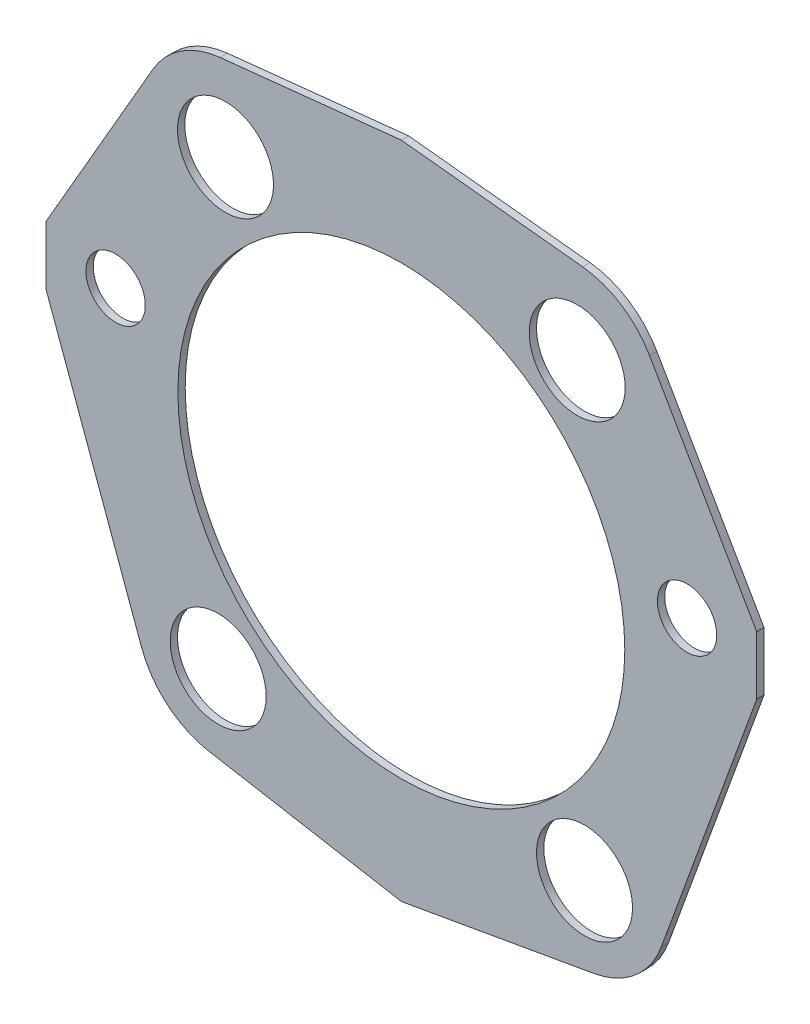
ISO-10303-21;
HEADER;
FILE_DESCRIPTION(('STEP AP214'),'2;1');
FILE_NAME('part.step','',(''),(''),'','','');
FILE_SCHEMA(('AUTOMOTIVE_DESIGN { 1 0 10303 214 1 1 1 1 }'));
ENDSEC;
DATA;
#1=APPLICATION_CONTEXT('core data for automotive mechanical design processes');
#2=APPLICATION_PROTOCOL_DEFINITION('international standard','automotive_design',2000,#1);
#3=PRODUCT_CONTEXT('',#1,'mechanical');
#4=PRODUCT('Part','Part','',(#3));
#5=PRODUCT_RELATED_PRODUCT_CATEGORY('part','',(#4));
#6=PRODUCT_DEFINITION_FORMATION('','',#4);
#7=PRODUCT_DEFINITION_CONTEXT('part definition',#1,'design');
#8=PRODUCT_DEFINITION('design','',#6,#7);
#9=PRODUCT_DEFINITION_SHAPE('','',#8);
#10=(LENGTH_UNIT() NAMED_UNIT(*) SI_UNIT(.MILLI.,.METRE.));
#11=(NAMED_UNIT(*) PLANE_ANGLE_UNIT() SI_UNIT($,.RADIAN.));
#12=(NAMED_UNIT(*) SI_UNIT($,.STERADIAN.) SOLID_ANGLE_UNIT());
#13=UNCERTAINTY_MEASURE_WITH_UNIT(LENGTH_MEASURE(1.E-05),#10,'distance_accuracy_value','');
#14=(GEOMETRIC_REPRESENTATION_CONTEXT(3) GLOBAL_UNCERTAINTY_ASSIGNED_CONTEXT((#13)) GLOBAL_UNIT_ASSIGNED_CONTEXT((#10,
#11,#12)) REPRESENTATION_CONTEXT('',''));
#15=CARTESIAN_POINT('',(0.,0.,0.));
#16=DIRECTION('',(0.,0.,1.));
#17=DIRECTION('',(1.,0.,0.));
#18=AXIS2_PLACEMENT_3D('',#15,#16,#17);
#19=CARTESIAN_POINT('',(0.,45.,-1.));
#20=DIRECTION('',(-0.104528463267654,0.994521895368273,0.));
#21=DIRECTION('',(-0.994521895368273,-0.104528463267654,0.));
#22=AXIS2_PLACEMENT_3D('',#19,#20,#21);
#23=PLANE('',#22);
#24=DIRECTION('',(-0.994521895368273,-0.104528463267654,0.));
#25=VECTOR('',#24,1.);
#26=CARTESIAN_POINT('',(0.,45.,0.));
#27=LINE('',#26,#25);
#28=CARTESIAN_POINT('',(0.,45.,0.));
#29=VERTEX_POINT('',#28);
#30=CARTESIAN_POINT('',(-24.7424653911129,42.3994620964796,0.));
#31=VERTEX_POINT('',#30);
#32=EDGE_CURVE('E174',#29,#31,#27,.T.);
#33=ORIENTED_EDGE('',*,*,#32,.F.);
#34=DIRECTION('',(0.,0.,1.));
#35=VECTOR('',#34,1.);
#36=CARTESIAN_POINT('',(0.,45.,-1.));
#37=LINE('',#36,#35);
#38=CARTESIAN_POINT('',(0.,45.,-1.));
#39=VERTEX_POINT('',#38);
#40=EDGE_CURVE('E11',#39,#29,#37,.T.);
#41=ORIENTED_EDGE('',*,*,#40,.F.);
#42=DIRECTION('',(-0.994521895368273,-0.104528463267654,0.));
#43=VECTOR('',#42,1.);
#44=CARTESIAN_POINT('',(0.,45.,-1.));
#45=LINE('',#44,#43);
#46=CARTESIAN_POINT('',(-24.7424653911129,42.3994620964796,-1.));
#47=VERTEX_POINT('',#46);
#48=EDGE_CURVE('E213',#39,#47,#45,.T.);
#49=ORIENTED_EDGE('',*,*,#48,.T.);
#50=DIRECTION('',(0.,0.,1.));
#51=VECTOR('',#50,1.);
#52=CARTESIAN_POINT('',(-24.7424653911129,42.3994620964796,-1.));
#53=LINE('',#52,#51);
#54=EDGE_CURVE('E44',#47,#31,#53,.T.);
#55=ORIENTED_EDGE('',*,*,#54,.T.);
#56=EDGE_LOOP('',(#33,#41,#49,#55));
#57=FACE_BOUND('',#56,.T.);
#58=ADVANCED_FACE('F41',(#57),#23,.T.);
#59=CARTESIAN_POINT('',(0.,45.,-1.));
#60=DIRECTION('',(0.104528463267654,0.994521895368273,0.));
#61=DIRECTION('',(-0.994521895368273,0.104528463267654,0.));
#62=AXIS2_PLACEMENT_3D('',#59,#60,#61);
#63=PLANE('',#62);
#64=DIRECTION('',(-0.994521895368273,0.104528463267654,0.));
#65=VECTOR('',#64,1.);
#66=CARTESIAN_POINT('',(0.,45.,0.));
#67=LINE('',#66,#65);
#68=CARTESIAN_POINT('',(24.7424653911129,42.3994620964796,0.));
#69=VERTEX_POINT('',#68);
#70=EDGE_CURVE('E211',#69,#29,#67,.T.);
#71=ORIENTED_EDGE('',*,*,#70,.F.);
#72=DIRECTION('',(0.,0.,1.));
#73=VECTOR('',#72,1.);
#74=CARTESIAN_POINT('',(24.7424653911129,42.3994620964796,-1.));
#75=LINE('',#74,#73);
#76=CARTESIAN_POINT('',(24.7424653911129,42.3994620964796,-1.));
#77=VERTEX_POINT('',#76);
#78=EDGE_CURVE('E50',#77,#69,#75,.T.);
#79=ORIENTED_EDGE('',*,*,#78,.F.);
#80=DIRECTION('',(-0.994521895368273,0.104528463267654,0.));
#81=VECTOR('',#80,1.);
#82=CARTESIAN_POINT('',(0.,45.,-1.));
#83=LINE('',#82,#81);
#84=EDGE_CURVE('E164',#77,#39,#83,.T.);
#85=ORIENTED_EDGE('',*,*,#84,.T.);
#86=ORIENTED_EDGE('',*,*,#40,.T.);
#87=EDGE_LOOP('',(#71,#79,#85,#86));
#88=FACE_BOUND('',#87,.T.);
#89=ADVANCED_FACE('F237',(#88),#63,.T.);
#90=CARTESIAN_POINT('',(23.488123831901,30.4651993520603,-1.));
#91=DIRECTION('',(0.,0.,1.));
#92=DIRECTION('',(1.,0.,0.));
#93=AXIS2_PLACEMENT_3D('',#90,#91,#92);
#94=CYLINDRICAL_SURFACE('',#93,12.);
#95=CARTESIAN_POINT('',(23.488123831901,30.4651993520603,0.));
#96=DIRECTION('',(0.,0.,1.));
#97=DIRECTION('',(-1.,0.,0.));
#98=AXIS2_PLACEMENT_3D('',#95,#96,#97);
#99=CIRCLE('',#98,12.);
#100=CARTESIAN_POINT('',(33.8804286773143,36.4651993520603,0.));
#101=VERTEX_POINT('',#100);
#102=EDGE_CURVE('E151',#101,#69,#99,.T.);
#103=ORIENTED_EDGE('',*,*,#102,.F.);
#104=DIRECTION('',(0.,0.,1.));
#105=VECTOR('',#104,1.);
#106=CARTESIAN_POINT('',(33.8804286773143,36.4651993520603,-1.));
#107=LINE('',#106,#105);
#108=CARTESIAN_POINT('',(33.8804286773143,36.4651993520603,-1.));
#109=VERTEX_POINT('',#108);
#110=EDGE_CURVE('E146',#109,#101,#107,.T.);
#111=ORIENTED_EDGE('',*,*,#110,.F.);
#112=CARTESIAN_POINT('',(23.488123831901,30.4651993520603,-1.));
#113=DIRECTION('',(0.,0.,1.));
#114=DIRECTION('',(-1.,0.,0.));
#115=AXIS2_PLACEMENT_3D('',#112,#113,#114);
#116=CIRCLE('',#115,12.);
#117=EDGE_CURVE('E149',#109,#77,#116,.T.);
#118=ORIENTED_EDGE('',*,*,#117,.T.);
#119=ORIENTED_EDGE('',*,*,#78,.T.);
#120=EDGE_LOOP('',(#103,#111,#118,#119));
#121=FACE_BOUND('',#120,.T.);
#122=ADVANCED_FACE('F148',(#121),#94,.T.);
#123=CARTESIAN_POINT('',(33.8804286773143,36.4651993520603,-1.));
#124=DIRECTION('',(0.86602540378444,0.499999999999998,0.));
#125=DIRECTION('',(-0.499999999999998,0.86602540378444,0.));
#126=AXIS2_PLACEMENT_3D('',#123,#124,#125);
#127=PLANE('',#126);
#128=DIRECTION('',(-0.499999999999998,0.86602540378444,0.));
#129=VECTOR('',#128,1.);
#130=CARTESIAN_POINT('',(33.8804286773143,36.4651993520603,0.));
#131=LINE('',#130,#129);
#132=CARTESIAN_POINT('',(48.5,11.1433590362916,0.));
#133=VERTEX_POINT('',#132);
#134=EDGE_CURVE('E208',#133,#101,#131,.T.);
#135=ORIENTED_EDGE('',*,*,#134,.F.);
#136=DIRECTION('',(0.,0.,1.));
#137=VECTOR('',#136,1.);
#138=CARTESIAN_POINT('',(48.5,11.1433590362916,-1.));
#139=LINE('',#138,#137);
#140=CARTESIAN_POINT('',(48.5,11.1433590362916,-1.));
#141=VERTEX_POINT('',#140);
#142=EDGE_CURVE('E156',#141,#133,#139,.T.);
#143=ORIENTED_EDGE('',*,*,#142,.F.);
#144=DIRECTION('',(-0.499999999999998,0.86602540378444,0.));
#145=VECTOR('',#144,1.);
#146=CARTESIAN_POINT('',(33.8804286773143,36.4651993520603,-1.));
#147=LINE('',#146,#145);
#148=EDGE_CURVE('E162',#141,#109,#147,.T.);
#149=ORIENTED_EDGE('',*,*,#148,.T.);
#150=ORIENTED_EDGE('',*,*,#110,.T.);
#151=EDGE_LOOP('',(#135,#143,#149,#150));
#152=FACE_BOUND('',#151,.T.);
#153=ADVANCED_FACE('F166',(#152),#127,.T.);
#154=CARTESIAN_POINT('',(48.5,11.1433590362916,-1.));
#155=DIRECTION('',(1.,0.,0.));
#156=DIRECTION('',(0.,0.,-1.));
#157=AXIS2_PLACEMENT_3D('',#154,#155,#156);
#158=PLANE('',#157);
#159=DIRECTION('',(0.,1.,0.));
#160=VECTOR('',#159,1.);
#161=CARTESIAN_POINT('',(48.5,11.1433590362916,0.));
#162=LINE('',#161,#160);
#163=CARTESIAN_POINT('',(48.5,3.14335903629156,0.));
#164=VERTEX_POINT('',#163);
#165=EDGE_CURVE('E205',#164,#133,#162,.T.);
#166=ORIENTED_EDGE('',*,*,#165,.F.);
#167=DIRECTION('',(0.,0.,1.));
#168=VECTOR('',#167,1.);
#169=CARTESIAN_POINT('',(48.5,3.14335903629156,-1.));
#170=LINE('',#169,#168);
#171=CARTESIAN_POINT('',(48.5,3.14335903629156,-1.));
#172=VERTEX_POINT('',#171);
#173=EDGE_CURVE('E217',#172,#164,#170,.T.);
#174=ORIENTED_EDGE('',*,*,#173,.F.);
#175=DIRECTION('',(0.,1.,0.));
#176=VECTOR('',#175,1.);
#177=CARTESIAN_POINT('',(48.5,11.1433590362916,-1.));
#178=LINE('',#177,#176);
#179=EDGE_CURVE('E167',#172,#141,#178,.T.);
#180=ORIENTED_EDGE('',*,*,#179,.T.);
#181=ORIENTED_EDGE('',*,*,#142,.T.);
#182=EDGE_LOOP('',(#166,#174,#180,#181));
#183=FACE_BOUND('',#182,.T.);
#184=ADVANCED_FACE('F250',(#183),#158,.T.);
#185=CARTESIAN_POINT('',(48.5,3.14335903629156,-1.));
#186=DIRECTION('',(0.939692620785907,-0.342020143325672,0.));
#187=DIRECTION('',(0.342020143325672,0.939692620785907,0.));
#188=AXIS2_PLACEMENT_3D('',#185,#186,#187);
#189=PLANE('',#188);
#190=DIRECTION('',(0.342020143325672,0.939692620785907,0.));
#191=VECTOR('',#190,1.);
#192=CARTESIAN_POINT('',(48.5,3.14335903629156,0.));
#193=LINE('',#192,#191);
#194=CARTESIAN_POINT('',(35.4712249054733,-32.6529063390727,0.));
#195=VERTEX_POINT('',#194);
#196=EDGE_CURVE('E202',#195,#164,#193,.T.);
#197=ORIENTED_EDGE('',*,*,#196,.F.);
#198=DIRECTION('',(0.,0.,1.));
#199=VECTOR('',#198,1.);
#200=CARTESIAN_POINT('',(35.4712249054733,-32.6529063390727,-1.));
#201=LINE('',#200,#199);
#202=CARTESIAN_POINT('',(35.4712249054733,-32.6529063390727,-1.));
#203=VERTEX_POINT('',#202);
#204=EDGE_CURVE('E219',#203,#195,#201,.T.);
#205=ORIENTED_EDGE('',*,*,#204,.F.);
#206=DIRECTION('',(0.342020143325672,0.939692620785907,0.));
#207=VECTOR('',#206,1.);
#208=CARTESIAN_POINT('',(48.5,3.14335903629156,-1.));
#209=LINE('',#208,#207);
#210=EDGE_CURVE('E169',#203,#172,#209,.T.);
#211=ORIENTED_EDGE('',*,*,#210,.T.);
#212=ORIENTED_EDGE('',*,*,#173,.T.);
#213=EDGE_LOOP('',(#197,#205,#211,#212));
#214=FACE_BOUND('',#213,.T.);
#215=ADVANCED_FACE('F253',(#214),#189,.T.);
#216=CARTESIAN_POINT('',(24.1949134560425,-28.5486646191647,-1.));
#217=DIRECTION('',(0.,0.,1.));
#218=DIRECTION('',(1.,0.,0.));
#219=AXIS2_PLACEMENT_3D('',#216,#217,#218);
#220=CYLINDRICAL_SURFACE('',#219,12.);
#221=CARTESIAN_POINT('',(24.1949134560425,-28.5486646191647,0.));
#222=DIRECTION('',(0.,0.,1.));
#223=DIRECTION('',(-1.,0.,0.));
#224=AXIS2_PLACEMENT_3D('',#221,#222,#223);
#225=CIRCLE('',#224,12.);
#226=CARTESIAN_POINT('',(26.2786915880455,-40.3663576553112,0.));
#227=VERTEX_POINT('',#226);
#228=EDGE_CURVE('E199',#227,#195,#225,.T.);
#229=ORIENTED_EDGE('',*,*,#228,.F.);
#230=DIRECTION('',(0.,0.,1.));
#231=VECTOR('',#230,1.);
#232=CARTESIAN_POINT('',(26.2786915880455,-40.3663576553112,-1.));
#233=LINE('',#232,#231);
#234=CARTESIAN_POINT('',(26.2786915880455,-40.3663576553112,-1.));
#235=VERTEX_POINT('',#234);
#236=EDGE_CURVE('E221',#235,#227,#233,.T.);
#237=ORIENTED_EDGE('',*,*,#236,.F.);
#238=CARTESIAN_POINT('',(24.1949134560425,-28.5486646191647,-1.));
#239=DIRECTION('',(0.,0.,1.));
#240=DIRECTION('',(-1.,0.,0.));
#241=AXIS2_PLACEMENT_3D('',#238,#239,#240);
#242=CIRCLE('',#241,12.);
#243=EDGE_CURVE('E391',#235,#203,#242,.T.);
#244=ORIENTED_EDGE('',*,*,#243,.T.);
#245=ORIENTED_EDGE('',*,*,#204,.T.);
#246=EDGE_LOOP('',(#229,#237,#244,#245));
#247=FACE_BOUND('',#246,.T.);
#248=ADVANCED_FACE('F257',(#247),#220,.T.);
#249=CARTESIAN_POINT('',(26.2786915880455,-40.3663576553112,-1.));
#250=DIRECTION('',(0.173648177666923,-0.984807753012209,0.));
#251=DIRECTION('',(0.984807753012209,0.173648177666923,0.));
#252=AXIS2_PLACEMENT_3D('',#249,#250,#251);
#253=PLANE('',#252);
#254=DIRECTION('',(0.984807753012209,0.173648177666923,0.));
#255=VECTOR('',#254,1.);
#256=CARTESIAN_POINT('',(26.2786915880455,-40.3663576553112,0.));
#257=LINE('',#256,#255);
#258=CARTESIAN_POINT('',(0.,-45.,0.));
#259=VERTEX_POINT('',#258);
#260=EDGE_CURVE('E196',#259,#227,#257,.T.);
#261=ORIENTED_EDGE('',*,*,#260,.F.);
#262=DIRECTION('',(0.,0.,1.));
#263=VECTOR('',#262,1.);
#264=CARTESIAN_POINT('',(0.,-45.,-1.));
#265=LINE('',#264,#263);
#266=CARTESIAN_POINT('',(0.,-45.,-1.));
#267=VERTEX_POINT('',#266);
#268=EDGE_CURVE('E223',#267,#259,#265,.T.);
#269=ORIENTED_EDGE('',*,*,#268,.F.);
#270=DIRECTION('',(0.984807753012209,0.173648177666923,0.));
#271=VECTOR('',#270,1.);
#272=CARTESIAN_POINT('',(26.2786915880455,-40.3663576553112,-1.));
#273=LINE('',#272,#271);
#274=EDGE_CURVE('E388',#267,#235,#273,.T.);
#275=ORIENTED_EDGE('',*,*,#274,.T.);
#276=ORIENTED_EDGE('',*,*,#236,.T.);
#277=EDGE_LOOP('',(#261,#269,#275,#276));
#278=FACE_BOUND('',#277,.T.);
#279=ADVANCED_FACE('F261',(#278),#253,.T.);
#280=CARTESIAN_POINT('',(-26.2786915880455,-40.3663576553112,-1.));
#281=DIRECTION('',(-0.173648177666923,-0.984807753012209,0.));
#282=DIRECTION('',(0.984807753012209,-0.173648177666923,0.));
#283=AXIS2_PLACEMENT_3D('',#280,#281,#282);
#284=PLANE('',#283);
#285=DIRECTION('',(0.984807753012209,-0.173648177666923,0.));
#286=VECTOR('',#285,1.);
#287=CARTESIAN_POINT('',(-26.2786915880455,-40.3663576553112,0.));
#288=LINE('',#287,#286);
#289=CARTESIAN_POINT('',(-26.2786915880455,-40.3663576553112,0.));
#290=VERTEX_POINT('',#289);
#291=EDGE_CURVE('E193',#290,#259,#288,.T.);
#292=ORIENTED_EDGE('',*,*,#291,.F.);
#293=DIRECTION('',(0.,0.,1.));
#294=VECTOR('',#293,1.);
#295=CARTESIAN_POINT('',(-26.2786915880455,-40.3663576553112,-1.));
#296=LINE('',#295,#294);
#297=CARTESIAN_POINT('',(-26.2786915880455,-40.3663576553112,-1.));
#298=VERTEX_POINT('',#297);
#299=EDGE_CURVE('E225',#298,#290,#296,.T.);
#300=ORIENTED_EDGE('',*,*,#299,.F.);
#301=DIRECTION('',(0.984807753012209,-0.173648177666923,0.));
#302=VECTOR('',#301,1.);
#303=CARTESIAN_POINT('',(-26.2786915880455,-40.3663576553112,-1.));
#304=LINE('',#303,#302);
#305=EDGE_CURVE('E385',#298,#267,#304,.T.);
#306=ORIENTED_EDGE('',*,*,#305,.T.);
#307=ORIENTED_EDGE('',*,*,#268,.T.);
#308=EDGE_LOOP('',(#292,#300,#306,#307));
#309=FACE_BOUND('',#308,.T.);
#310=ADVANCED_FACE('F265',(#309),#284,.T.);
#311=CARTESIAN_POINT('',(-24.1949134560425,-28.5486646191647,-1.));
#312=DIRECTION('',(0.,0.,1.));
#313=DIRECTION('',(1.,0.,0.));
#314=AXIS2_PLACEMENT_3D('',#311,#312,#313);
#315=CYLINDRICAL_SURFACE('',#314,12.);
#316=CARTESIAN_POINT('',(-24.1949134560425,-28.5486646191647,0.));
#317=DIRECTION('',(0.,0.,1.));
#318=DIRECTION('',(1.,0.,0.));
#319=AXIS2_PLACEMENT_3D('',#316,#317,#318);
#320=CIRCLE('',#319,12.);
#321=CARTESIAN_POINT('',(-35.4712249054733,-32.6529063390727,0.));
#322=VERTEX_POINT('',#321);
#323=EDGE_CURVE('E190',#322,#290,#320,.T.);
#324=ORIENTED_EDGE('',*,*,#323,.F.);
#325=DIRECTION('',(0.,0.,1.));
#326=VECTOR('',#325,1.);
#327=CARTESIAN_POINT('',(-35.4712249054733,-32.6529063390727,-1.));
#328=LINE('',#327,#326);
#329=CARTESIAN_POINT('',(-35.4712249054733,-32.6529063390727,-1.));
#330=VERTEX_POINT('',#329);
#331=EDGE_CURVE('E227',#330,#322,#328,.T.);
#332=ORIENTED_EDGE('',*,*,#331,.F.);
#333=CARTESIAN_POINT('',(-24.1949134560425,-28.5486646191647,-1.));
#334=DIRECTION('',(0.,0.,1.));
#335=DIRECTION('',(1.,0.,0.));
#336=AXIS2_PLACEMENT_3D('',#333,#334,#335);
#337=CIRCLE('',#336,12.);
#338=EDGE_CURVE('E382',#330,#298,#337,.T.);
#339=ORIENTED_EDGE('',*,*,#338,.T.);
#340=ORIENTED_EDGE('',*,*,#299,.T.);
#341=EDGE_LOOP('',(#324,#332,#339,#340));
#342=FACE_BOUND('',#341,.T.);
#343=ADVANCED_FACE('F269',(#342),#315,.T.);
#344=CARTESIAN_POINT('',(-48.5,3.14335903629156,-1.));
#345=DIRECTION('',(-0.939692620785907,-0.342020143325672,0.));
#346=DIRECTION('',(0.342020143325672,-0.939692620785907,0.));
#347=AXIS2_PLACEMENT_3D('',#344,#345,#346);
#348=PLANE('',#347);
#349=DIRECTION('',(0.342020143325672,-0.939692620785907,0.));
#350=VECTOR('',#349,1.);
#351=CARTESIAN_POINT('',(-48.5,3.14335903629156,0.));
#352=LINE('',#351,#350);
#353=CARTESIAN_POINT('',(-48.5,3.14335903629156,0.));
#354=VERTEX_POINT('',#353);
#355=EDGE_CURVE('E187',#354,#322,#352,.T.);
#356=ORIENTED_EDGE('',*,*,#355,.F.);
#357=DIRECTION('',(0.,0.,1.));
#358=VECTOR('',#357,1.);
#359=CARTESIAN_POINT('',(-48.5,3.14335903629156,-1.));
#360=LINE('',#359,#358);
#361=CARTESIAN_POINT('',(-48.5,3.14335903629156,-1.));
#362=VERTEX_POINT('',#361);
#363=EDGE_CURVE('E229',#362,#354,#360,.T.);
#364=ORIENTED_EDGE('',*,*,#363,.F.);
#365=DIRECTION('',(0.342020143325672,-0.939692620785907,0.));
#366=VECTOR('',#365,1.);
#367=CARTESIAN_POINT('',(-48.5,3.14335903629156,-1.));
#368=LINE('',#367,#366);
#369=EDGE_CURVE('E379',#362,#330,#368,.T.);
#370=ORIENTED_EDGE('',*,*,#369,.T.);
#371=ORIENTED_EDGE('',*,*,#331,.T.);
#372=EDGE_LOOP('',(#356,#364,#370,#371));
#373=FACE_BOUND('',#372,.T.);
#374=ADVANCED_FACE('F273',(#373),#348,.T.);
#375=CARTESIAN_POINT('',(-48.5,11.1433590362916,-1.));
#376=DIRECTION('',(-1.,0.,0.));
#377=DIRECTION('',(0.,0.,1.));
#378=AXIS2_PLACEMENT_3D('',#375,#376,#377);
#379=PLANE('',#378);
#380=DIRECTION('',(0.,-1.,0.));
#381=VECTOR('',#380,1.);
#382=CARTESIAN_POINT('',(-48.5,11.1433590362916,0.));
#383=LINE('',#382,#381);
#384=CARTESIAN_POINT('',(-48.5,11.1433590362916,0.));
#385=VERTEX_POINT('',#384);
#386=EDGE_CURVE('E184',#385,#354,#383,.T.);
#387=ORIENTED_EDGE('',*,*,#386,.F.);
#388=DIRECTION('',(0.,0.,1.));
#389=VECTOR('',#388,1.);
#390=CARTESIAN_POINT('',(-48.5,11.1433590362916,-1.));
#391=LINE('',#390,#389);
#392=CARTESIAN_POINT('',(-48.5,11.1433590362916,-1.));
#393=VERTEX_POINT('',#392);
#394=EDGE_CURVE('E231',#393,#385,#391,.T.);
#395=ORIENTED_EDGE('',*,*,#394,.F.);
#396=DIRECTION('',(0.,-1.,0.));
#397=VECTOR('',#396,1.);
#398=CARTESIAN_POINT('',(-48.5,11.1433590362916,-1.));
#399=LINE('',#398,#397);
#400=EDGE_CURVE('E376',#393,#362,#399,.T.);
#401=ORIENTED_EDGE('',*,*,#400,.T.);
#402=ORIENTED_EDGE('',*,*,#363,.T.);
#403=EDGE_LOOP('',(#387,#395,#401,#402));
#404=FACE_BOUND('',#403,.T.);
#405=ADVANCED_FACE('F277',(#404),#379,.T.);
#406=CARTESIAN_POINT('',(-33.8804286773143,36.4651993520603,-1.));
#407=DIRECTION('',(-0.86602540378444,0.499999999999997,0.));
#408=DIRECTION('',(-0.499999999999997,-0.86602540378444,0.));
#409=AXIS2_PLACEMENT_3D('',#406,#407,#408);
#410=PLANE('',#409);
#411=DIRECTION('',(-0.499999999999997,-0.86602540378444,0.));
#412=VECTOR('',#411,1.);
#413=CARTESIAN_POINT('',(-33.8804286773143,36.4651993520603,0.));
#414=LINE('',#413,#412);
#415=CARTESIAN_POINT('',(-33.8804286773143,36.4651993520603,0.));
#416=VERTEX_POINT('',#415);
#417=EDGE_CURVE('E181',#416,#385,#414,.T.);
#418=ORIENTED_EDGE('',*,*,#417,.F.);
#419=DIRECTION('',(0.,0.,1.));
#420=VECTOR('',#419,1.);
#421=CARTESIAN_POINT('',(-33.8804286773143,36.4651993520603,-1.));
#422=LINE('',#421,#420);
#423=CARTESIAN_POINT('',(-33.8804286773143,36.4651993520603,-1.));
#424=VERTEX_POINT('',#423);
#425=EDGE_CURVE('E232',#424,#416,#422,.T.);
#426=ORIENTED_EDGE('',*,*,#425,.F.);
#427=DIRECTION('',(-0.499999999999997,-0.86602540378444,0.));
#428=VECTOR('',#427,1.);
#429=CARTESIAN_POINT('',(-33.8804286773143,36.4651993520603,-1.));
#430=LINE('',#429,#428);
#431=EDGE_CURVE('E373',#424,#393,#430,.T.);
#432=ORIENTED_EDGE('',*,*,#431,.T.);
#433=ORIENTED_EDGE('',*,*,#394,.T.);
#434=EDGE_LOOP('',(#418,#426,#432,#433));
#435=FACE_BOUND('',#434,.T.);
#436=ADVANCED_FACE('F281',(#435),#410,.T.);
#437=CARTESIAN_POINT('',(-23.488123831901,30.4651993520603,-1.));
#438=DIRECTION('',(0.,0.,1.));
#439=DIRECTION('',(1.,0.,0.));
#440=AXIS2_PLACEMENT_3D('',#437,#438,#439);
#441=CYLINDRICAL_SURFACE('',#440,12.);
#442=CARTESIAN_POINT('',(-23.488123831901,30.4651993520603,0.));
#443=DIRECTION('',(0.,0.,1.));
#444=DIRECTION('',(1.,0.,0.));
#445=AXIS2_PLACEMENT_3D('',#442,#443,#444);
#446=CIRCLE('',#445,12.);
#447=EDGE_CURVE('E177',#31,#416,#446,.T.);
#448=ORIENTED_EDGE('',*,*,#447,.F.);
#449=ORIENTED_EDGE('',*,*,#54,.F.);
#450=CARTESIAN_POINT('',(-23.488123831901,30.4651993520603,-1.));
#451=DIRECTION('',(0.,0.,1.));
#452=DIRECTION('',(1.,0.,0.));
#453=AXIS2_PLACEMENT_3D('',#450,#451,#452);
#454=CIRCLE('',#453,12.);
#455=EDGE_CURVE('E371',#47,#424,#454,.T.);
#456=ORIENTED_EDGE('',*,*,#455,.T.);
#457=ORIENTED_EDGE('',*,*,#425,.T.);
#458=EDGE_LOOP('',(#448,#449,#456,#457));
#459=FACE_BOUND('',#458,.T.);
#460=ADVANCED_FACE('F234',(#459),#441,.T.);
#461=CARTESIAN_POINT('',(-23.488123831901,30.4651993520603,-1.));
#462=DIRECTION('',(0.,0.,1.));
#463=DIRECTION('',(1.,0.,0.));
#464=AXIS2_PLACEMENT_3D('',#461,#462,#463);
#465=PLANE('',#464);
#466=CARTESIAN_POINT('',(-39.,8.,-1.));
#467=DIRECTION('',(0.,0.,1.));
#468=DIRECTION('',(-1.,0.,0.));
#469=AXIS2_PLACEMENT_3D('',#466,#467,#468);
#470=CIRCLE('',#469,4.05);
#471=CARTESIAN_POINT('',(-43.05,8.,-1.));
#472=VERTEX_POINT('',#471);
#473=EDGE_CURVE('E328',#472,#472,#470,.T.);
#474=ORIENTED_EDGE('',*,*,#473,.T.);
#475=EDGE_LOOP('',(#474));
#476=FACE_BOUND('',#475,.T.);
#477=CARTESIAN_POINT('',(39.,8.,-1.));
#478=DIRECTION('',(0.,0.,1.));
#479=DIRECTION('',(1.,0.,0.));
#480=AXIS2_PLACEMENT_3D('',#477,#478,#479);
#481=CIRCLE('',#480,4.05);
#482=CARTESIAN_POINT('',(43.05,8.,-1.));
#483=VERTEX_POINT('',#482);
#484=EDGE_CURVE('E336',#483,#483,#481,.T.);
#485=ORIENTED_EDGE('',*,*,#484,.T.);
#486=EDGE_LOOP('',(#485));
#487=FACE_BOUND('',#486,.T.);
#488=CARTESIAN_POINT('',(25.,-30.,-1.));
#489=DIRECTION('',(0.,0.,1.));
#490=DIRECTION('',(-1.,0.,0.));
#491=AXIS2_PLACEMENT_3D('',#488,#489,#490);
#492=CIRCLE('',#491,6.55);
#493=CARTESIAN_POINT('',(18.45,-30.,-1.));
#494=VERTEX_POINT('',#493);
#495=EDGE_CURVE('E342',#494,#494,#492,.T.);
#496=ORIENTED_EDGE('',*,*,#495,.T.);
#497=EDGE_LOOP('',(#496));
#498=FACE_BOUND('',#497,.T.);
#499=CARTESIAN_POINT('',(-25.,-30.,-1.));
#500=DIRECTION('',(0.,0.,1.));
#501=DIRECTION('',(1.,0.,0.));
#502=AXIS2_PLACEMENT_3D('',#499,#500,#501);
#503=CIRCLE('',#502,6.55);
#504=CARTESIAN_POINT('',(-18.45,-30.,-1.));
#505=VERTEX_POINT('',#504);
#506=EDGE_CURVE('E348',#505,#505,#503,.T.);
#507=ORIENTED_EDGE('',*,*,#506,.T.);
#508=EDGE_LOOP('',(#507));
#509=FACE_BOUND('',#508,.T.);
#510=CARTESIAN_POINT('',(-24.,31.,-1.));
#511=DIRECTION('',(0.,0.,1.));
#512=DIRECTION('',(-1.,0.,0.));
#513=AXIS2_PLACEMENT_3D('',#510,#511,#512);
#514=CIRCLE('',#513,6.55);
#515=CARTESIAN_POINT('',(-30.55,31.,-1.));
#516=VERTEX_POINT('',#515);
#517=EDGE_CURVE('E354',#516,#516,#514,.T.);
#518=ORIENTED_EDGE('',*,*,#517,.T.);
#519=EDGE_LOOP('',(#518));
#520=FACE_BOUND('',#519,.T.);
#521=CARTESIAN_POINT('',(24.,31.,-1.));
#522=DIRECTION('',(0.,0.,1.));
#523=DIRECTION('',(1.,0.,0.));
#524=AXIS2_PLACEMENT_3D('',#521,#522,#523);
#525=CIRCLE('',#524,6.55);
#526=CARTESIAN_POINT('',(30.55,31.,-1.));
#527=VERTEX_POINT('',#526);
#528=EDGE_CURVE('E360',#527,#527,#525,.T.);
#529=ORIENTED_EDGE('',*,*,#528,.T.);
#530=EDGE_LOOP('',(#529));
#531=FACE_BOUND('',#530,.T.);
#532=CARTESIAN_POINT('',(0.,0.,-1.));
#533=DIRECTION('',(0.,0.,1.));
#534=DIRECTION('',(1.,0.,0.));
#535=AXIS2_PLACEMENT_3D('',#532,#533,#534);
#536=CIRCLE('',#535,30.5);
#537=CARTESIAN_POINT('',(30.5,0.,-1.));
#538=VERTEX_POINT('',#537);
#539=EDGE_CURVE('E178',#538,#538,#536,.T.);
#540=ORIENTED_EDGE('',*,*,#539,.T.);
#541=EDGE_LOOP('',(#540));
#542=FACE_BOUND('',#541,.T.);
#543=ORIENTED_EDGE('',*,*,#48,.F.);
#544=ORIENTED_EDGE('',*,*,#84,.F.);
#545=ORIENTED_EDGE('',*,*,#117,.F.);
#546=ORIENTED_EDGE('',*,*,#148,.F.);
#547=ORIENTED_EDGE('',*,*,#179,.F.);
#548=ORIENTED_EDGE('',*,*,#210,.F.);
#549=ORIENTED_EDGE('',*,*,#243,.F.);
#550=ORIENTED_EDGE('',*,*,#274,.F.);
#551=ORIENTED_EDGE('',*,*,#305,.F.);
#552=ORIENTED_EDGE('',*,*,#338,.F.);
#553=ORIENTED_EDGE('',*,*,#369,.F.);
#554=ORIENTED_EDGE('',*,*,#400,.F.);
#555=ORIENTED_EDGE('',*,*,#431,.F.);
#556=ORIENTED_EDGE('',*,*,#455,.F.);
#557=EDGE_LOOP('',(#543,#544,#545,#546,#547,#548,#549,#550,#551,#552,#553,#554,#555,#556));
#558=FACE_BOUND('',#557,.T.);
#559=ADVANCED_FACE('F160',(#476,#487,#498,#509,#520,#531,#542,#558),#465,.F.);
#560=CARTESIAN_POINT('',(-23.488123831901,30.4651993520603,0.));
#561=DIRECTION('',(0.,0.,1.));
#562=DIRECTION('',(1.,0.,0.));
#563=AXIS2_PLACEMENT_3D('',#560,#561,#562);
#564=PLANE('',#563);
#565=CARTESIAN_POINT('',(-39.,8.,0.));
#566=DIRECTION('',(0.,0.,1.));
#567=DIRECTION('',(-1.,0.,0.));
#568=AXIS2_PLACEMENT_3D('',#565,#566,#567);
#569=CIRCLE('',#568,4.05);
#570=CARTESIAN_POINT('',(-43.05,8.,0.));
#571=VERTEX_POINT('',#570);
#572=EDGE_CURVE('E331',#571,#571,#569,.T.);
#573=ORIENTED_EDGE('',*,*,#572,.F.);
#574=EDGE_LOOP('',(#573));
#575=FACE_BOUND('',#574,.T.);
#576=CARTESIAN_POINT('',(39.,8.,0.));
#577=DIRECTION('',(0.,0.,1.));
#578=DIRECTION('',(1.,0.,0.));
#579=AXIS2_PLACEMENT_3D('',#576,#577,#578);
#580=CIRCLE('',#579,4.05);
#581=CARTESIAN_POINT('',(43.05,8.,0.));
#582=VERTEX_POINT('',#581);
#583=EDGE_CURVE('E333',#582,#582,#580,.T.);
#584=ORIENTED_EDGE('',*,*,#583,.F.);
#585=EDGE_LOOP('',(#584));
#586=FACE_BOUND('',#585,.T.);
#587=CARTESIAN_POINT('',(25.,-30.,0.));
#588=DIRECTION('',(0.,0.,1.));
#589=DIRECTION('',(-1.,0.,0.));
#590=AXIS2_PLACEMENT_3D('',#587,#588,#589);
#591=CIRCLE('',#590,6.55);
#592=CARTESIAN_POINT('',(18.45,-30.,0.));
#593=VERTEX_POINT('',#592);
#594=EDGE_CURVE('E339',#593,#593,#591,.T.);
#595=ORIENTED_EDGE('',*,*,#594,.F.);
#596=EDGE_LOOP('',(#595));
#597=FACE_BOUND('',#596,.T.);
#598=CARTESIAN_POINT('',(-25.,-30.,0.));
#599=DIRECTION('',(0.,0.,1.));
#600=DIRECTION('',(1.,0.,0.));
#601=AXIS2_PLACEMENT_3D('',#598,#599,#600);
#602=CIRCLE('',#601,6.55);
#603=CARTESIAN_POINT('',(-18.45,-30.,0.));
#604=VERTEX_POINT('',#603);
#605=EDGE_CURVE('E345',#604,#604,#602,.T.);
#606=ORIENTED_EDGE('',*,*,#605,.F.);
#607=EDGE_LOOP('',(#606));
#608=FACE_BOUND('',#607,.T.);
#609=CARTESIAN_POINT('',(-24.,31.,0.));
#610=DIRECTION('',(0.,0.,1.));
#611=DIRECTION('',(-1.,0.,0.));
#612=AXIS2_PLACEMENT_3D('',#609,#610,#611);
#613=CIRCLE('',#612,6.55);
#614=CARTESIAN_POINT('',(-30.55,31.,0.));
#615=VERTEX_POINT('',#614);
#616=EDGE_CURVE('E351',#615,#615,#613,.T.);
#617=ORIENTED_EDGE('',*,*,#616,.F.);
#618=EDGE_LOOP('',(#617));
#619=FACE_BOUND('',#618,.T.);
#620=CARTESIAN_POINT('',(24.,31.,0.));
#621=DIRECTION('',(0.,0.,1.));
#622=DIRECTION('',(1.,0.,0.));
#623=AXIS2_PLACEMENT_3D('',#620,#621,#622);
#624=CIRCLE('',#623,6.55);
#625=CARTESIAN_POINT('',(30.55,31.,0.));
#626=VERTEX_POINT('',#625);
#627=EDGE_CURVE('E357',#626,#626,#624,.T.);
#628=ORIENTED_EDGE('',*,*,#627,.F.);
#629=EDGE_LOOP('',(#628));
#630=FACE_BOUND('',#629,.T.);
#631=CARTESIAN_POINT('',(0.,0.,0.));
#632=DIRECTION('',(0.,0.,1.));
#633=DIRECTION('',(1.,0.,0.));
#634=AXIS2_PLACEMENT_3D('',#631,#632,#633);
#635=CIRCLE('',#634,30.5);
#636=CARTESIAN_POINT('',(30.5,0.,0.));
#637=VERTEX_POINT('',#636);
#638=EDGE_CURVE('E363',#637,#637,#635,.T.);
#639=ORIENTED_EDGE('',*,*,#638,.F.);
#640=EDGE_LOOP('',(#639));
#641=FACE_BOUND('',#640,.T.);
#642=ORIENTED_EDGE('',*,*,#32,.T.);
#643=ORIENTED_EDGE('',*,*,#447,.T.);
#644=ORIENTED_EDGE('',*,*,#417,.T.);
#645=ORIENTED_EDGE('',*,*,#386,.T.);
#646=ORIENTED_EDGE('',*,*,#355,.T.);
#647=ORIENTED_EDGE('',*,*,#323,.T.);
#648=ORIENTED_EDGE('',*,*,#291,.T.);
#649=ORIENTED_EDGE('',*,*,#260,.T.);
#650=ORIENTED_EDGE('',*,*,#228,.T.);
#651=ORIENTED_EDGE('',*,*,#196,.T.);
#652=ORIENTED_EDGE('',*,*,#165,.T.);
#653=ORIENTED_EDGE('',*,*,#134,.T.);
#654=ORIENTED_EDGE('',*,*,#102,.T.);
#655=ORIENTED_EDGE('',*,*,#70,.T.);
#656=EDGE_LOOP('',(#642,#643,#644,#645,#646,#647,#648,#649,#650,#651,#652,#653,#654,#655));
#657=FACE_BOUND('',#656,.T.);
#658=ADVANCED_FACE('F236',(#575,#586,#597,#608,#619,#630,#641,#657),#564,.T.);
#659=CARTESIAN_POINT('',(0.,0.,-1.));
#660=DIRECTION('',(0.,0.,1.));
#661=DIRECTION('',(1.,0.,0.));
#662=AXIS2_PLACEMENT_3D('',#659,#660,#661);
#663=CYLINDRICAL_SURFACE('',#662,30.5);
#664=ORIENTED_EDGE('',*,*,#539,.F.);
#665=EDGE_LOOP('',(#664));
#666=FACE_BOUND('',#665,.T.);
#667=ORIENTED_EDGE('',*,*,#638,.T.);
#668=EDGE_LOOP('',(#667));
#669=FACE_BOUND('',#668,.T.);
#670=ADVANCED_FACE('F293',(#666,#669),#663,.F.);
#671=CARTESIAN_POINT('',(24.,31.,-1.));
#672=DIRECTION('',(0.,0.,1.));
#673=DIRECTION('',(1.,0.,0.));
#674=AXIS2_PLACEMENT_3D('',#671,#672,#673);
#675=CYLINDRICAL_SURFACE('',#674,6.55);
#676=ORIENTED_EDGE('',*,*,#528,.F.);
#677=EDGE_LOOP('',(#676));
#678=FACE_BOUND('',#677,.T.);
#679=ORIENTED_EDGE('',*,*,#627,.T.);
#680=EDGE_LOOP('',(#679));
#681=FACE_BOUND('',#680,.T.);
#682=ADVANCED_FACE('F300',(#678,#681),#675,.F.);
#683=CARTESIAN_POINT('',(-24.,31.,-1.));
#684=DIRECTION('',(0.,0.,1.));
#685=DIRECTION('',(1.,0.,0.));
#686=AXIS2_PLACEMENT_3D('',#683,#684,#685);
#687=CYLINDRICAL_SURFACE('',#686,6.55);
#688=ORIENTED_EDGE('',*,*,#517,.F.);
#689=EDGE_LOOP('',(#688));
#690=FACE_BOUND('',#689,.T.);
#691=ORIENTED_EDGE('',*,*,#616,.T.);
#692=EDGE_LOOP('',(#691));
#693=FACE_BOUND('',#692,.T.);
#694=ADVANCED_FACE('F304',(#690,#693),#687,.F.);
#695=CARTESIAN_POINT('',(-25.,-30.,-1.));
#696=DIRECTION('',(0.,0.,1.));
#697=DIRECTION('',(1.,0.,0.));
#698=AXIS2_PLACEMENT_3D('',#695,#696,#697);
#699=CYLINDRICAL_SURFACE('',#698,6.55);
#700=ORIENTED_EDGE('',*,*,#506,.F.);
#701=EDGE_LOOP('',(#700));
#702=FACE_BOUND('',#701,.T.);
#703=ORIENTED_EDGE('',*,*,#605,.T.);
#704=EDGE_LOOP('',(#703));
#705=FACE_BOUND('',#704,.T.);
#706=ADVANCED_FACE('F308',(#702,#705),#699,.F.);
#707=CARTESIAN_POINT('',(25.,-30.,-1.));
#708=DIRECTION('',(0.,0.,1.));
#709=DIRECTION('',(1.,0.,0.));
#710=AXIS2_PLACEMENT_3D('',#707,#708,#709);
#711=CYLINDRICAL_SURFACE('',#710,6.55);
#712=ORIENTED_EDGE('',*,*,#495,.F.);
#713=EDGE_LOOP('',(#712));
#714=FACE_BOUND('',#713,.T.);
#715=ORIENTED_EDGE('',*,*,#594,.T.);
#716=EDGE_LOOP('',(#715));
#717=FACE_BOUND('',#716,.T.);
#718=ADVANCED_FACE('F312',(#714,#717),#711,.F.);
#719=CARTESIAN_POINT('',(39.,8.,-1.));
#720=DIRECTION('',(0.,0.,1.));
#721=DIRECTION('',(1.,0.,0.));
#722=AXIS2_PLACEMENT_3D('',#719,#720,#721);
#723=CYLINDRICAL_SURFACE('',#722,4.05);
#724=ORIENTED_EDGE('',*,*,#484,.F.);
#725=EDGE_LOOP('',(#724));
#726=FACE_BOUND('',#725,.T.);
#727=ORIENTED_EDGE('',*,*,#583,.T.);
#728=EDGE_LOOP('',(#727));
#729=FACE_BOUND('',#728,.T.);
#730=ADVANCED_FACE('F316',(#726,#729),#723,.F.);
#731=CARTESIAN_POINT('',(-39.,8.,-1.));
#732=DIRECTION('',(0.,0.,1.));
#733=DIRECTION('',(1.,0.,0.));
#734=AXIS2_PLACEMENT_3D('',#731,#732,#733);
#735=CYLINDRICAL_SURFACE('',#734,4.05);
#736=ORIENTED_EDGE('',*,*,#473,.F.);
#737=EDGE_LOOP('',(#736));
#738=FACE_BOUND('',#737,.T.);
#739=ORIENTED_EDGE('',*,*,#572,.T.);
#740=EDGE_LOOP('',(#739));
#741=FACE_BOUND('',#740,.T.);
#742=ADVANCED_FACE('F320',(#738,#741),#735,.F.);
#743=CLOSED_SHELL('',(#58,#89,#122,#153,#184,#215,#248,#279,#310,#343,#374,#405,#436,#460,#559,
#658,#670,#682,#694,#706,#718,#730,#742));
#744=MANIFOLD_SOLID_BREP('B2',#743);
#745=ADVANCED_BREP_SHAPE_REPRESENTATION('',(#18,#744),#14);
#746=SHAPE_DEFINITION_REPRESENTATION(#9,#745);
ENDSEC;
END-ISO-10303-21;
